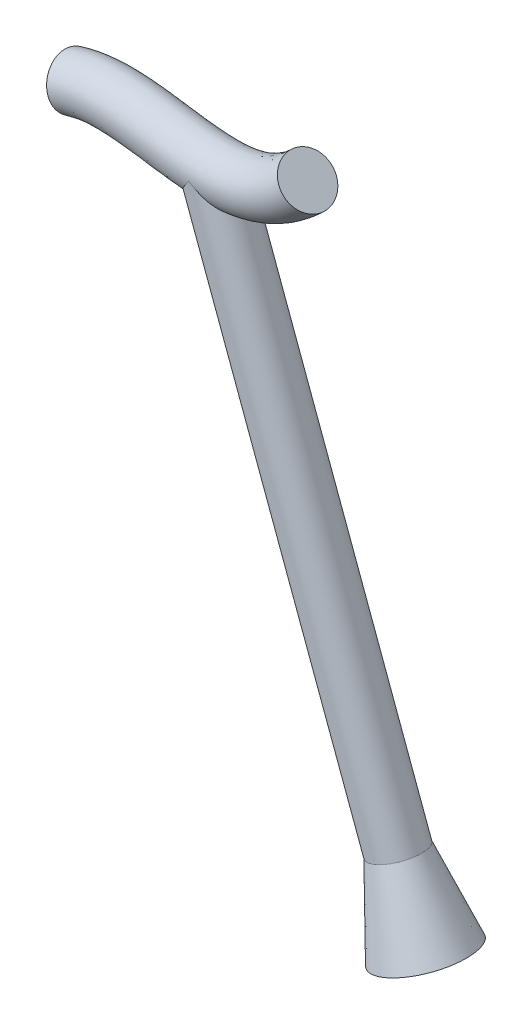
ISO-10303-21;
HEADER;
FILE_DESCRIPTION(('STEP AP214'),'2;1');
FILE_NAME('part.step','',(''),(''),'','','');
FILE_SCHEMA(('AUTOMOTIVE_DESIGN { 1 0 10303 214 1 1 1 1 }'));
ENDSEC;
DATA;
#1=APPLICATION_CONTEXT('core data for automotive mechanical design processes');
#2=APPLICATION_PROTOCOL_DEFINITION('international standard','automotive_design',2000,#1);
#3=PRODUCT_CONTEXT('',#1,'mechanical');
#4=PRODUCT('Part','Part','',(#3));
#5=PRODUCT_RELATED_PRODUCT_CATEGORY('part','',(#4));
#6=PRODUCT_DEFINITION_FORMATION('','',#4);
#7=PRODUCT_DEFINITION_CONTEXT('part definition',#1,'design');
#8=PRODUCT_DEFINITION('design','',#6,#7);
#9=PRODUCT_DEFINITION_SHAPE('','',#8);
#10=(LENGTH_UNIT() NAMED_UNIT(*) SI_UNIT(.MILLI.,.METRE.));
#11=(NAMED_UNIT(*) PLANE_ANGLE_UNIT() SI_UNIT($,.RADIAN.));
#12=(NAMED_UNIT(*) SI_UNIT($,.STERADIAN.) SOLID_ANGLE_UNIT());
#13=UNCERTAINTY_MEASURE_WITH_UNIT(LENGTH_MEASURE(1.E-05),#10,'distance_accuracy_value','');
#14=(GEOMETRIC_REPRESENTATION_CONTEXT(3) GLOBAL_UNCERTAINTY_ASSIGNED_CONTEXT((#13)) GLOBAL_UNIT_ASSIGNED_CONTEXT((#10,
#11,#12)) REPRESENTATION_CONTEXT('',''));
#15=CARTESIAN_POINT('',(0.,0.,0.));
#16=DIRECTION('',(0.,0.,1.));
#17=DIRECTION('',(1.,0.,0.));
#18=AXIS2_PLACEMENT_3D('',#15,#16,#17);
#19=CARTESIAN_POINT('',(-3.8409942819326,11.8952411882299,0.));
#20=CARTESIAN_POINT('',(2.21893063812587,13.8520015925863,0.));
#21=CARTESIAN_POINT('',(8.23706637894599,14.9009551730432,0.));
#22=CARTESIAN_POINT('',(19.9006047173071,15.7834034528897,0.));
#23=CARTESIAN_POINT('',(25.5492961775394,15.6264071761493,0.));
#24=CARTESIAN_POINT('',(36.4282667797137,14.7533963977823,0.));
#25=CARTESIAN_POINT('',(41.6643514853813,14.038061912149,0.));
#26=CARTESIAN_POINT('',(51.7418355635534,12.5815355559079,0.));
#27=CARTESIAN_POINT('',(56.5841652917562,11.8401739007415,0.));
#28=CARTESIAN_POINT('',(65.8524684579819,10.7621530429953,0.));
#29=CARTESIAN_POINT('',(70.2743927939615,10.4263181048556,0.));
#30=CARTESIAN_POINT('',(78.6781011249228,10.4760550908266,0.));
#31=CARTESIAN_POINT('',(82.6521479202523,10.8555686916251,0.));
#32=CARTESIAN_POINT('',(90.3302115567345,12.5779145045922,0.));
#33=CARTESIAN_POINT('',(94.0443000745698,13.9093804203333,0.));
#34=CARTESIAN_POINT('',(101.625127607982,18.016303336636,0.));
#35=CARTESIAN_POINT('',(105.505323844153,20.8047100970525,0.));
#36=CARTESIAN_POINT('',(109.554296204998,24.6991172938591,0.));
#37=CARTESIAN_POINT('',(-3.8409942819326,11.8952411882299,25.));
#38=CARTESIAN_POINT('',(2.21893063812587,13.8520015925863,25.));
#39=CARTESIAN_POINT('',(8.23706637894599,14.9009551730432,25.));
#40=CARTESIAN_POINT('',(19.9006047173071,15.7834034528897,25.));
#41=CARTESIAN_POINT('',(25.5492961775394,15.6264071761493,25.));
#42=CARTESIAN_POINT('',(36.4282667797137,14.7533963977823,25.));
#43=CARTESIAN_POINT('',(41.6643514853813,14.038061912149,25.));
#44=CARTESIAN_POINT('',(51.7418355635534,12.5815355559079,25.));
#45=CARTESIAN_POINT('',(56.5841652917562,11.8401739007415,25.));
#46=CARTESIAN_POINT('',(65.8524684579819,10.7621530429953,25.));
#47=CARTESIAN_POINT('',(70.2743927939615,10.4263181048556,25.));
#48=CARTESIAN_POINT('',(78.6781011249228,10.4760550908266,25.));
#49=CARTESIAN_POINT('',(82.6521479202523,10.8555686916251,25.));
#50=CARTESIAN_POINT('',(90.3302115567345,12.5779145045922,25.));
#51=CARTESIAN_POINT('',(94.0443000745698,13.9093804203333,25.));
#52=CARTESIAN_POINT('',(101.625127607982,18.016303336636,25.));
#53=CARTESIAN_POINT('',(105.505323844153,20.8047100970525,25.));
#54=CARTESIAN_POINT('',(109.554296204998,24.6991172938591,25.));
#55=CARTESIAN_POINT('',(3.8409942819326,-11.8952411882299,25.));
#56=CARTESIAN_POINT('',(7.7970306486509,-10.6178300943379,25.));
#57=CARTESIAN_POINT('',(11.7885963077395,-9.90179155204792,25.));
#58=CARTESIAN_POINT('',(20.1212293950451,-9.27135527129357,25.));
#59=CARTESIAN_POINT('',(24.4590079604851,-9.36646655887717,25.));
#60=CARTESIAN_POINT('',(33.5190344346674,-10.0935115207392,25.));
#61=CARTESIAN_POINT('',(38.2354767797811,-10.7261252151171,25.));
#62=CARTESIAN_POINT('',(48.0183922275681,-12.1400767610303,25.));
#63=CARTESIAN_POINT('',(53.0839349745449,-12.9212448321236,25.));
#64=CARTESIAN_POINT('',(63.5760105825688,-14.1416058995007,25.));
#65=CARTESIAN_POINT('',(69.0065925455896,-14.5816231644159,25.));
#66=CARTESIAN_POINT('',(80.2418190358159,-14.5151279596039,25.));
#67=CARTESIAN_POINT('',(86.0542007625944,-14.0025571707703,25.));
#68=CARTESIAN_POINT('',(97.8722047931959,-11.3515385381499,25.));
#69=CARTESIAN_POINT('',(103.867755420165,-9.20172440187472,25.));
#70=CARTESIAN_POINT('',(115.618705197776,-2.83563247933951,25.));
#71=CARTESIAN_POINT('',(121.360647128679,1.36769554528867,25.));
#72=CARTESIAN_POINT('',(126.884706644812,6.68088003302806,25.));
#73=CARTESIAN_POINT('',(3.8409942819326,-11.8952411882299,0.));
#74=CARTESIAN_POINT('',(7.7970306486509,-10.6178300943379,0.));
#75=CARTESIAN_POINT('',(11.7885963077395,-9.90179155204792,0.));
#76=CARTESIAN_POINT('',(20.1212293950451,-9.27135527129357,0.));
#77=CARTESIAN_POINT('',(24.4590079604808,-9.36646655887934,0.));
#78=CARTESIAN_POINT('',(33.5190344346718,-10.093511520737,0.));
#79=CARTESIAN_POINT('',(38.2354767797811,-10.7261252151214,0.));
#80=CARTESIAN_POINT('',(48.0183922275681,-12.140076761026,0.));
#81=CARTESIAN_POINT('',(53.0839349745449,-12.9212448321193,0.));
#82=CARTESIAN_POINT('',(63.5760105825688,-14.1416058995051,0.));
#83=CARTESIAN_POINT('',(69.0065925455896,-14.581623164418,0.));
#84=CARTESIAN_POINT('',(80.2418190358159,-14.5151279596018,0.));
#85=CARTESIAN_POINT('',(86.0542007625944,-14.0025571707703,0.));
#86=CARTESIAN_POINT('',(97.8722047931959,-11.3515385381499,0.));
#87=CARTESIAN_POINT('',(103.867755420165,-9.2017244018771,0.));
#88=CARTESIAN_POINT('',(115.618705197776,-2.83563247933713,0.));
#89=CARTESIAN_POINT('',(121.360647128679,1.36769554527715,0.));
#90=CARTESIAN_POINT('',(126.884706644812,6.68088003302805,0.));
#91=CARTESIAN_POINT('',(3.8409942819326,-11.8952411882299,-25.));
#92=CARTESIAN_POINT('',(7.7970306486509,-10.6178300943379,-25.));
#93=CARTESIAN_POINT('',(11.7885963077395,-9.90179155204793,-25.));
#94=CARTESIAN_POINT('',(20.1212293950451,-9.27135527129357,-25.));
#95=CARTESIAN_POINT('',(24.4590079604764,-9.36646655888152,-25.));
#96=CARTESIAN_POINT('',(33.5190344346761,-10.0935115207349,-25.));
#97=CARTESIAN_POINT('',(38.2354767797811,-10.7261252151258,-25.));
#98=CARTESIAN_POINT('',(48.0183922275681,-12.1400767610216,-25.));
#99=CARTESIAN_POINT('',(53.0839349745449,-12.921244832115,-25.));
#100=CARTESIAN_POINT('',(63.5760105825688,-14.1416058995094,-25.));
#101=CARTESIAN_POINT('',(69.0065925455896,-14.5816231644201,-25.));
#102=CARTESIAN_POINT('',(80.2418190358159,-14.5151279595997,-25.));
#103=CARTESIAN_POINT('',(86.0542007625944,-14.0025571707703,-25.));
#104=CARTESIAN_POINT('',(97.8722047931959,-11.3515385381499,-25.));
#105=CARTESIAN_POINT('',(103.867755420165,-9.20172440187949,-25.));
#106=CARTESIAN_POINT('',(115.618705197776,-2.83563247933475,-25.));
#107=CARTESIAN_POINT('',(121.360647128679,1.36769554526563,-25.));
#108=CARTESIAN_POINT('',(126.884706644812,6.68088003302805,-25.));
#109=CARTESIAN_POINT('',(-3.8409942819326,11.8952411882299,-25.));
#110=CARTESIAN_POINT('',(2.21893063812587,13.8520015925863,-25.));
#111=CARTESIAN_POINT('',(8.23706637894599,14.9009551730432,-25.));
#112=CARTESIAN_POINT('',(19.9006047173071,15.7834034528897,-25.));
#113=CARTESIAN_POINT('',(25.5492961775394,15.6264071761493,-25.));
#114=CARTESIAN_POINT('',(36.4282667797137,14.7533963977823,-25.));
#115=CARTESIAN_POINT('',(41.6643514853813,14.038061912149,-25.));
#116=CARTESIAN_POINT('',(51.7418355635534,12.5815355559079,-25.));
#117=CARTESIAN_POINT('',(56.5841652917562,11.8401739007415,-25.));
#118=CARTESIAN_POINT('',(65.8524684579819,10.7621530429953,-25.));
#119=CARTESIAN_POINT('',(70.2743927939615,10.4263181048556,-25.));
#120=CARTESIAN_POINT('',(78.6781011249228,10.4760550908266,-25.));
#121=CARTESIAN_POINT('',(82.6521479202523,10.8555686916251,-25.));
#122=CARTESIAN_POINT('',(90.3302115567345,12.5779145045922,-25.));
#123=CARTESIAN_POINT('',(94.0443000745698,13.9093804203333,-25.));
#124=CARTESIAN_POINT('',(101.625127607982,18.016303336636,-25.));
#125=CARTESIAN_POINT('',(105.505323844153,20.8047100970525,-25.));
#126=CARTESIAN_POINT('',(109.554296204998,24.6991172938591,-25.));
#127=CARTESIAN_POINT('',(-3.8409942819326,11.8952411882299,0.));
#128=CARTESIAN_POINT('',(2.21893063812587,13.8520015925863,0.));
#129=CARTESIAN_POINT('',(8.23706637894599,14.9009551730432,0.));
#130=CARTESIAN_POINT('',(19.9006047173071,15.7834034528897,0.));
#131=CARTESIAN_POINT('',(25.5492961775394,15.6264071761493,0.));
#132=CARTESIAN_POINT('',(36.4282667797137,14.7533963977823,0.));
#133=CARTESIAN_POINT('',(41.6643514853813,14.038061912149,0.));
#134=CARTESIAN_POINT('',(51.7418355635534,12.5815355559079,0.));
#135=CARTESIAN_POINT('',(56.5841652917562,11.8401739007415,0.));
#136=CARTESIAN_POINT('',(65.8524684579819,10.7621530429953,0.));
#137=CARTESIAN_POINT('',(70.2743927939615,10.4263181048556,0.));
#138=CARTESIAN_POINT('',(78.6781011249228,10.4760550908266,0.));
#139=CARTESIAN_POINT('',(82.6521479202523,10.8555686916251,0.));
#140=CARTESIAN_POINT('',(90.3302115567345,12.5779145045922,0.));
#141=CARTESIAN_POINT('',(94.0443000745698,13.9093804203333,0.));
#142=CARTESIAN_POINT('',(101.625127607982,18.016303336636,0.));
#143=CARTESIAN_POINT('',(105.505323844153,20.8047100970525,0.));
#144=CARTESIAN_POINT('',(109.554296204998,24.6991172938591,0.));
#145=(BOUNDED_SURFACE() B_SPLINE_SURFACE(3,3,((#19,#20,#21,#22,#23,#24,#25,#26,#27,#28,#29,#30,
#31,#32,#33,#34,#35,#36),(#37,#38,#39,#40,#41,#42,#43,#44,#45,#46,#47,#48,#49,#50,#51,#52,#53,
#54),(#55,#56,#57,#58,#59,#60,#61,#62,#63,#64,#65,#66,#67,#68,#69,#70,#71,#72),(#73,#74,#75,#76,
#77,#78,#79,#80,#81,#82,#83,#84,#85,#86,#87,#88,#89,#90),(#91,#92,#93,#94,#95,#96,#97,#98,#99,
#100,#101,#102,#103,#104,#105,#106,#107,#108),(#109,#110,#111,#112,#113,#114,#115,#116,#117,
#118,#119,#120,#121,#122,#123,#124,#125,#126),(#127,#128,#129,#130,#131,#132,#133,#134,#135,
#136,#137,#138,#139,#140,#141,#142,#143,#144)),.UNSPECIFIED.,.T.,.F.,
.F.) B_SPLINE_SURFACE_WITH_KNOTS((4,3,4),(4,2,2,2,2,2,2,2,4),(0.,0.5,1.),(0.,0.125,0.25,0.375,
0.5,0.625,0.75,0.875,1.),
.UNSPECIFIED.) GEOMETRIC_REPRESENTATION_ITEM() RATIONAL_B_SPLINE_SURFACE(((1.,1.,1.,1.,1.,1.,1.,
1.,1.,1.,1.,1.,1.,1.,1.,1.,1.,1.),(0.333333333333333,0.333333333333333,0.333333333333333,
0.333333333333333,0.333333333333333,0.333333333333333,0.333333333333333,0.333333333333333,
0.333333333333333,0.333333333333333,0.333333333333333,0.333333333333333,0.333333333333333,
0.333333333333333,0.333333333333333,0.333333333333333,0.333333333333333,0.333333333333333),
(0.333333333333333,0.333333333333333,0.333333333333333,0.333333333333333,0.333333333333333,
0.333333333333333,0.333333333333333,0.333333333333333,0.333333333333333,0.333333333333333,
0.333333333333333,0.333333333333333,0.333333333333333,0.333333333333333,0.333333333333333,
0.333333333333333,0.333333333333333,0.333333333333333),(1.,1.,1.,1.,1.,1.,1.,1.,1.,1.,1.,1.,1.,
1.,1.,1.,1.,1.),(0.333333333333333,0.333333333333333,0.333333333333333,0.333333333333333,
0.333333333333333,0.333333333333333,0.333333333333333,0.333333333333333,0.333333333333333,
0.333333333333333,0.333333333333333,0.333333333333333,0.333333333333333,0.333333333333333,
0.333333333333333,0.333333333333333,0.333333333333333,0.333333333333333),(0.333333333333333,
0.333333333333333,0.333333333333333,0.333333333333333,0.333333333333333,0.333333333333333,
0.333333333333333,0.333333333333333,0.333333333333333,0.333333333333333,0.333333333333333,
0.333333333333333,0.333333333333333,0.333333333333333,0.333333333333333,0.333333333333333,
0.333333333333333,0.333333333333333),(1.,1.,1.,1.,1.,1.,1.,1.,1.,1.,1.,1.,1.,1.,1.,1.,1.,1.))) REPRESENTATION_ITEM('') SURFACE());
#146=CARTESIAN_POINT('',(118.219501424905,15.6899986634436,0.));
#147=DIRECTION('',(0.720729490433241,0.693216417592545,0.));
#148=DIRECTION('',(-0.693216417592545,0.720729490433241,0.));
#149=AXIS2_PLACEMENT_3D('',#146,#147,#148);
#150=CIRCLE('',#149,12.5);
#151=CARTESIAN_POINT('',(109.554296204998,24.6991172938591,0.));
#152=VERTEX_POINT('',#151);
#153=EDGE_CURVE('E11',#152,#152,#150,.T.);
#154=CARTESIAN_POINT('',(0.,0.,0.));
#155=DIRECTION('',(0.951619295058392,0.307279542554608,0.));
#156=DIRECTION('',(-0.307279542554608,0.951619295058392,0.));
#157=AXIS2_PLACEMENT_3D('',#154,#155,#156);
#158=CIRCLE('',#157,12.5);
#159=CARTESIAN_POINT('',(-3.8409942819326,11.8952411882299,0.));
#160=VERTEX_POINT('',#159);
#161=EDGE_CURVE('E48',#160,#160,#158,.T.);
#162=CARTESIAN_POINT('',(70.8833939212575,-1.99642209426536,-12.5));
#163=CARTESIAN_POINT('',(70.8788605008631,-2.00270262592796,-12.5000000023641));
#164=CARTESIAN_POINT('',(70.8743268421096,-2.00898306460194,-12.4999950440189));
#165=CARTESIAN_POINT('',(70.5590476205257,-2.44570727571388,-12.4993052403453));
#166=CARTESIAN_POINT('',(70.2472045075634,-2.87568608407201,-12.4753190884259));
#167=CARTESIAN_POINT('',(69.624068319824,-3.73119474749942,-12.3802376486848));
#168=CARTESIAN_POINT('',(69.3127759128584,-4.15672063089727,-12.3091034334096));
#169=CARTESIAN_POINT('',(68.6926493530324,-5.0010358338427,-12.1188698894972));
#170=CARTESIAN_POINT('',(68.3838263943129,-5.41979894145436,-11.9996163087456));
#171=CARTESIAN_POINT('',(67.7728026919778,-6.24530042067836,-11.7126638076479));
#172=CARTESIAN_POINT('',(67.4706003697259,-6.65204166706071,-11.5449765741942));
#173=CARTESIAN_POINT('',(66.8987877807842,-7.41908248918136,-11.1754194300439));
#174=CARTESIAN_POINT('',(66.6284481464538,-7.7805598626948,-10.9771253621857));
#175=CARTESIAN_POINT('',(66.0992661207447,-8.48615146262647,-10.5388036095407));
#176=CARTESIAN_POINT('',(65.8404207737411,-8.83027015576226,-10.2987867322306));
#177=CARTESIAN_POINT('',(65.3382773486164,-9.49615473903047,-9.77808169214339));
#178=CARTESIAN_POINT('',(65.0949316006801,-9.8179894600182,-9.49752786630905));
#179=CARTESIAN_POINT('',(64.6261913333008,-10.4365415133496,-8.89552592477625));
#180=CARTESIAN_POINT('',(64.4008155837477,-10.7332326026691,-8.57403593762222));
#181=CARTESIAN_POINT('',(64.0370185830065,-11.2112274581814,-7.99503904128569));
#182=CARTESIAN_POINT('',(63.8928809374449,-11.4003334537603,-7.74750046590062));
#183=CARTESIAN_POINT('',(63.6168554241514,-11.7620363341834,-7.23423390064919));
#184=CARTESIAN_POINT('',(63.4849646389503,-11.9346371512148,-6.96851026919498));
#185=CARTESIAN_POINT('',(63.2349653202483,-12.2614570933924,-6.42018534728324));
#186=CARTESIAN_POINT('',(63.1168443845787,-12.4156927623066,-6.13759959649122));
#187=CARTESIAN_POINT('',(62.8957252384219,-12.7041582471131,-5.55688771714288));
#188=CARTESIAN_POINT('',(62.7927198643993,-12.8383975401045,-5.2587690412831));
#189=CARTESIAN_POINT('',(62.6024965500513,-13.0861181893895,-4.64657878811815));
#190=CARTESIAN_POINT('',(62.5153906696596,-13.1994522601479,-4.33241255595702));
#191=CARTESIAN_POINT('',(62.3591694055706,-13.4025948338201,-3.69241283754861));
#192=CARTESIAN_POINT('',(62.2900433778863,-13.4924172557191,-3.36658638466832));
#193=CARTESIAN_POINT('',(62.1708231501321,-13.6472678556969,-2.7057275993041));
#194=CARTESIAN_POINT('',(62.1207259292637,-13.7122999692109,-2.37069673707108));
#195=CARTESIAN_POINT('',(62.0403922765108,-13.8165567556893,-1.69425858540681));
#196=CARTESIAN_POINT('',(62.0101564627548,-13.8557806254471,-1.3528510978617));
#197=CARTESIAN_POINT('',(61.9721123144356,-13.9051298541456,-0.701708635828516));
#198=CARTESIAN_POINT('',(61.962338330704,-13.9178055999689,-0.392277916174887));
#199=CARTESIAN_POINT('',(61.95938555996,-13.9216352361026,0.22679116412378));
#200=CARTESIAN_POINT('',(61.9662059562067,-13.9127901856222,0.536429513799831));
#201=CARTESIAN_POINT('',(61.9963396036194,-13.8737038954522,1.15346194401768));
#202=CARTESIAN_POINT('',(62.0196488438955,-13.843467859092,1.46085655197869));
#203=CARTESIAN_POINT('',(62.082424197513,-13.76201130772,2.07118005771075));
#204=CARTESIAN_POINT('',(62.1218904427527,-13.7107906213993,2.3741089190046));
#205=CARTESIAN_POINT('',(62.2148438050151,-13.5900976457469,2.96325110946599));
#206=CARTESIAN_POINT('',(62.267815263501,-13.5212964382466,3.24968408563285));
#207=CARTESIAN_POINT('',(62.3876825972621,-13.3655216733767,3.81456062878617));
#208=CARTESIAN_POINT('',(62.4545779805332,-13.2785487581069,4.09300447767427));
#209=CARTESIAN_POINT('',(62.6015249168939,-13.0873689198479,4.64035576902131));
#210=CARTESIAN_POINT('',(62.6815777629556,-12.9831603031152,4.90926227109302));
#211=CARTESIAN_POINT('',(62.8539697976247,-12.7585713432885,5.43615446008714));
#212=CARTESIAN_POINT('',(62.9463095484638,-12.6381902601625,5.69413964655278));
#213=CARTESIAN_POINT('',(63.1485304802377,-12.3743204601947,6.21391824778825));
#214=CARTESIAN_POINT('',(63.2591502896018,-12.229853735048,6.47492756580338));
#215=CARTESIAN_POINT('',(63.4920853030818,-11.9253132675031,6.98218458326526));
#216=CARTESIAN_POINT('',(63.6144008842635,-11.7652390219231,7.22843180637287));
#217=CARTESIAN_POINT('',(63.869588747214,-11.4308678761968,7.70530852095081));
#218=CARTESIAN_POINT('',(64.0024617112114,-11.2565700568892,7.93593700133575));
#219=CARTESIAN_POINT('',(64.2776795409067,-10.8950656554297,8.38098113692999));
#220=CARTESIAN_POINT('',(64.4200279048983,-10.7078543046993,8.59539074105503));
#221=CARTESIAN_POINT('',(64.7319509728744,-10.2970254368589,9.03398003782317));
#222=CARTESIAN_POINT('',(64.902671358299,-10.0718240256886,9.25586315019352));
#223=CARTESIAN_POINT('',(65.2533243914284,-9.60843515433736,9.67787735234512));
#224=CARTESIAN_POINT('',(65.4332605025484,-9.37024280974402,9.87800017470829));
#225=CARTESIAN_POINT('',(65.8009851993093,-8.8825140667575,10.2562323583331));
#226=CARTESIAN_POINT('',(65.9887766965238,-8.63297345912575,10.4343334588064));
#227=CARTESIAN_POINT('',(66.3708778502338,-8.12416946537924,10.7683571648492));
#228=CARTESIAN_POINT('',(66.5651897631191,-7.8649027097931,10.9242719929776));
#229=CARTESIAN_POINT('',(67.2181250983613,-6.99174918196306,11.404259983087));
#230=CARTESIAN_POINT('',(67.6885680653803,-6.35952421384584,11.6801034308268));
#231=CARTESIAN_POINT('',(68.6441405285086,-5.06760405339333,12.1134446427612));
#232=CARTESIAN_POINT('',(69.1292590045247,-4.40792934030471,12.2710290222687));
#233=CARTESIAN_POINT('',(69.8248827863353,-3.45568959312487,12.4134496656025));
#234=CARTESIAN_POINT('',(70.03406695883,-3.1685261320925,12.4455472481836));
#235=CARTESIAN_POINT('',(70.4522572960651,-2.59273963894484,12.4885776210311));
#236=CARTESIAN_POINT('',(70.6612634565821,-2.30411810197096,12.4995288860879));
#237=CARTESIAN_POINT('',(70.8743268338628,-2.00898307571868,12.499995043863));
#238=CARTESIAN_POINT('',(70.8788604926876,-2.00270263691041,12.5000000022411));
#239=CARTESIAN_POINT('',(70.8833939212572,-1.99642209426462,12.5));
#240=B_SPLINE_CURVE_WITH_KNOTS('',3,(#162,#163,#164,#165,#166,#167,#168,#169,#170,#171,#172,
#173,#174,#175,#176,#177,#178,#179,#180,#181,#182,#183,#184,#185,#186,#187,#188,#189,#190,#191,
#192,#193,#194,#195,#196,#197,#198,#199,#200,#201,#202,#203,#204,#205,#206,#207,#208,#209,#210,
#211,#212,#213,#214,#215,#216,#217,#218,#219,#220,#221,#222,#223,#224,#225,#226,#227,#228,#229,
#230,#231,#232,#233,#234,#235,#236,#237,#238,#239),.UNSPECIFIED.,.F.,.F.,(4,2,2,2,2,2,2,2,2,2,2,
2,2,2,2,2,2,2,2,2,2,2,2,2,2,2,2,2,2,2,2,2,2,2,2,2,2,2,4),(0.,0.0232375044377404,
1.61589680243782,3.20987270869315,4.80899940301187,6.40774055484781,7.88472569669971,
9.36132882302326,10.8331462733749,12.3064814471818,13.3352085054178,14.3636898663228,
15.3912376225851,16.4182968218646,17.4523365827908,18.485762796648,19.5190248868014,
20.5523191327063,21.4806859935812,22.4090071630893,23.3371025972983,24.265205608199,
25.1621242781854,26.0590112607859,26.9559864324294,27.8530026625377,28.80653316351,
29.7600944161945,30.7137173391478,31.6676943112687,32.7445022208157,33.8217178244789,
34.899336295187,35.9773316014123,38.4717585066307,40.964356655685,42.0340673056477,
43.1028429636082,43.1260804680462),.UNSPECIFIED.);
#241=CARTESIAN_POINT('',(70.8833939212572,-1.99642209426462,12.5));
#242=VERTEX_POINT('',#241);
#243=CARTESIAN_POINT('',(70.8833939212575,-1.99642209426536,-12.5));
#244=VERTEX_POINT('',#243);
#245=EDGE_CURVE('E56',#242,#244,#240,.F.);
#246=CARTESIAN_POINT('',(70.8833939212575,-1.99642209426536,-12.5));
#247=CARTESIAN_POINT('',(70.8896742869409,-2.00095582797467,-12.4999999983891));
#248=CARTESIAN_POINT('',(70.8959548801108,-2.00548926930621,-12.499997757362));
#249=CARTESIAN_POINT('',(71.3092672993291,-2.30379529442233,-12.4997028453625));
#250=CARTESIAN_POINT('',(71.7172492845662,-2.59633546649777,-12.4900026856099));
#251=CARTESIAN_POINT('',(72.534519361312,-3.17836757783163,-12.4511663885178));
#252=CARTESIAN_POINT('',(72.9438076170995,-3.4678591122809,-12.4220277023065));
#253=CARTESIAN_POINT('',(73.7641088763109,-4.04396941713133,-12.3434070574586));
#254=CARTESIAN_POINT('',(74.1751235762192,-4.33057854304256,-12.293871399682));
#255=CARTESIAN_POINT('',(74.997037674837,-4.89953336809004,-12.1734459610974));
#256=CARTESIAN_POINT('',(75.4079370626725,-5.18187874793855,-12.1025545893268));
#257=CARTESIAN_POINT('',(76.2481733382089,-5.75490568958278,-11.9342936876984));
#258=CARTESIAN_POINT('',(76.6774573653698,-6.04534478758677,-11.8358249108733));
#259=CARTESIAN_POINT('',(77.5335678839909,-6.61991916070666,-11.6124325689005));
#260=CARTESIAN_POINT('',(77.960393695065,-6.90405274733612,-11.4875020100542));
#261=CARTESIAN_POINT('',(78.8099919601886,-7.46503535806251,-11.2091616445813));
#262=CARTESIAN_POINT('',(79.2327617348833,-7.74187975284092,-11.0557342152375));
#263=CARTESIAN_POINT('',(80.0699799521608,-8.28565964312778,-10.7188858503238));
#264=CARTESIAN_POINT('',(80.484455781843,-8.55263170599996,-10.5355929078248));
#265=CARTESIAN_POINT('',(81.3037894102784,-9.07614001285452,-10.1361215268271));
#266=CARTESIAN_POINT('',(81.7086519911445,-9.33268149277923,-9.91995985266153));
#267=CARTESIAN_POINT('',(82.5047951118438,-9.83318733239106,-9.452086014982));
#268=CARTESIAN_POINT('',(82.8960915244559,-10.0771665644579,-9.20041727355646));
#269=CARTESIAN_POINT('',(83.5259494636541,-10.4669228065231,-8.75381450220637));
#270=CARTESIAN_POINT('',(83.7697982681065,-10.6170416637977,-8.57008497415246));
#271=CARTESIAN_POINT('',(84.2481660605265,-10.9101282732571,-8.18555650350859));
#272=CARTESIAN_POINT('',(84.4826863104123,-11.053096993353,-7.98475988127291));
#273=CARTESIAN_POINT('',(84.9405705671792,-11.3309576185788,-7.56516081840703));
#274=CARTESIAN_POINT('',(85.1639260655319,-11.4658433788845,-7.34634497185619));
#275=CARTESIAN_POINT('',(85.5968937854152,-11.7261890566955,-6.89018754618767));
#276=CARTESIAN_POINT('',(85.8065055110408,-11.8516486341076,-6.65284529927366));
#277=CARTESIAN_POINT('',(86.2118745935003,-12.093309730504,-6.15588979680427));
#278=CARTESIAN_POINT('',(86.4074058980779,-12.2093628715718,-5.89601847520701));
#279=CARTESIAN_POINT('',(86.7780291690475,-12.4285411627168,-5.35684599473646));
#280=CARTESIAN_POINT('',(86.9531193600545,-12.5316651899108,-5.0775431515221));
#281=CARTESIAN_POINT('',(87.2786862360125,-12.7228163537051,-4.50074322298228));
#282=CARTESIAN_POINT('',(87.4292170342255,-12.8108767024125,-4.20328817795175));
#283=CARTESIAN_POINT('',(87.6337577726359,-12.930228057848,-3.7445292783042));
#284=CARTESIAN_POINT('',(87.6983886180218,-12.9678846946928,-3.5895339683824));
#285=CARTESIAN_POINT('',(87.8201264685993,-13.0387304188814,-3.27555100506406));
#286=CARTESIAN_POINT('',(87.8772312617463,-13.0719181928064,-3.11656219417953));
#287=CARTESIAN_POINT('',(88.008089978949,-13.1478926424584,-2.72023797027518));
#288=CARTESIAN_POINT('',(88.0772448309869,-13.1879706109883,-2.48083622549292));
#289=CARTESIAN_POINT('',(88.1968971198213,-13.2572410118903,-1.99593579870479));
#290=CARTESIAN_POINT('',(88.2473995641624,-13.2864363658982,-1.75043877199337));
#291=CARTESIAN_POINT('',(88.3286520594604,-13.3333781655289,-1.2552432709718));
#292=CARTESIAN_POINT('',(88.3594137070106,-13.351131332811,-1.00554735191143));
#293=CARTESIAN_POINT('',(88.4005145551269,-13.3748463299045,-0.503903044719156));
#294=CARTESIAN_POINT('',(88.4108525232616,-13.3808074481452,-0.251954521579244));
#295=CARTESIAN_POINT('',(88.4108511671826,-13.3808067232671,0.261178463865919));
#296=CARTESIAN_POINT('',(88.3997410009907,-13.3744003964241,0.522363373410993));
#297=CARTESIAN_POINT('',(88.3555854605151,-13.3489220094083,1.0422419924368));
#298=CARTESIAN_POINT('',(88.3225393382446,-13.3298495173361,1.30093561666285));
#299=CARTESIAN_POINT('',(88.2353095924219,-13.2794481731732,1.81366981225089));
#300=CARTESIAN_POINT('',(88.1811123949972,-13.248111450377,2.06770728565979));
#301=CARTESIAN_POINT('',(88.0528460122081,-13.1738334775015,2.56895044065112));
#302=CARTESIAN_POINT('',(87.9787764024701,-13.1308919796031,2.81615597621381));
#303=CARTESIAN_POINT('',(87.8130031763245,-13.0346006655426,3.30016501461181));
#304=CARTESIAN_POINT('',(87.7214455543895,-12.9813369714649,3.53703597486351));
#305=CARTESIAN_POINT('',(87.522015594119,-12.8650578053512,4.00127931712574));
#306=CARTESIAN_POINT('',(87.4141436753494,-12.8020425841009,4.22865194321949));
#307=CARTESIAN_POINT('',(87.1838143007954,-12.6671487675205,4.67310905537375));
#308=CARTESIAN_POINT('',(87.0613570600463,-12.595270302863,4.89019369304694));
#309=CARTESIAN_POINT('',(86.8034824851375,-12.4434805410455,5.31370890027355));
#310=CARTESIAN_POINT('',(86.66805808228,-12.3635648614067,5.52013356336907));
#311=CARTESIAN_POINT('',(86.3199442492535,-12.1575113836841,6.01590434588867));
#312=CARTESIAN_POINT('',(86.1007088668,-12.027217881924,6.29895083039134));
#313=CARTESIAN_POINT('',(85.6422741946376,-11.7534100483066,6.84154986296844));
#314=CARTESIAN_POINT('',(85.4030648987079,-11.6098890861806,7.10109049807902));
#315=CARTESIAN_POINT('',(84.9080284972444,-11.311303488491,7.59775986779404));
#316=CARTESIAN_POINT('',(84.6521686070722,-11.1562159853164,7.8348419823421));
#317=CARTESIAN_POINT('',(84.1274658830354,-10.8364061151449,8.28695448534527));
#318=CARTESIAN_POINT('',(83.8586232720998,-10.671683913577,8.50198525225076));
#319=CARTESIAN_POINT('',(83.1604292695893,-10.2414329635322,9.02322993529766));
#320=CARTESIAN_POINT('',(82.7237808590249,-9.97008574381867,9.3149159679445));
#321=CARTESIAN_POINT('',(81.8329450787299,-9.41134218550491,9.85267231320418));
#322=CARTESIAN_POINT('',(81.3787472579314,-9.12393623667213,10.0987149220231));
#323=CARTESIAN_POINT('',(80.4581688912793,-8.53592851191678,10.5492256297721));
#324=CARTESIAN_POINT('',(79.9917819680726,-8.2353197699511,10.7536714531213));
#325=CARTESIAN_POINT('',(79.0512803685401,-7.62341024334438,11.124353584644));
#326=CARTESIAN_POINT('',(78.5771680364039,-7.31211267149453,11.290601260632));
#327=CARTESIAN_POINT('',(77.5107553654949,-6.6053894239487,11.6234704216379));
#328=CARTESIAN_POINT('',(76.9171503367853,-6.20755559412378,11.7807870826852));
#329=CARTESIAN_POINT('',(75.7274836819541,-5.40125372229974,12.0465114549906));
#330=CARTESIAN_POINT('',(75.1314258506105,-4.99279899055184,12.1549775312628));
#331=CARTESIAN_POINT('',(73.9284117351511,-4.15953279256532,12.3286655468797));
#332=CARTESIAN_POINT('',(73.3214522048304,-3.73455927540752,12.3930748283202));
#333=CARTESIAN_POINT('',(72.1096944843148,-2.87728722131787,12.4785219967825));
#334=CARTESIAN_POINT('',(71.5048961211618,-2.44498928721159,12.4995634358172));
#335=CARTESIAN_POINT('',(70.8959548741825,-2.00548926567223,12.4999977555106));
#336=CARTESIAN_POINT('',(70.8896742810015,-2.00095582433916,12.4999999965104));
#337=CARTESIAN_POINT('',(70.8833939212572,-1.99642209426462,12.5));
#338=B_SPLINE_CURVE_WITH_KNOTS('',3,(#246,#247,#248,#249,#250,#251,#252,#253,#254,#255,#256,
#257,#258,#259,#260,#261,#262,#263,#264,#265,#266,#267,#268,#269,#270,#271,#272,#273,#274,#275,
#276,#277,#278,#279,#280,#281,#282,#283,#284,#285,#286,#287,#288,#289,#290,#291,#292,#293,#294,
#295,#296,#297,#298,#299,#300,#301,#302,#303,#304,#305,#306,#307,#308,#309,#310,#311,#312,#313,
#314,#315,#316,#317,#318,#319,#320,#321,#322,#323,#324,#325,#326,#327,#328,#329,#330,#331,#332,
#333,#334,#335,#336,#337),.UNSPECIFIED.,.F.,.F.,(4,2,2,2,2,2,2,2,2,2,2,2,2,2,2,2,2,2,2,2,2,2,2,
2,2,2,2,2,2,2,2,2,2,2,2,2,2,2,2,2,2,2,2,2,2,4),(0.,0.0232375006651249,1.52915517937384,
3.03527035997564,4.54537630524781,6.05559477855075,7.63766210645891,9.22014808866701,
10.8036159724062,12.3804680250019,13.9565185027528,15.5306580486292,16.5508003863065,
17.5708042518482,18.5915739559594,19.6123804713937,20.6470105703167,21.6817304638778,
22.7141387705399,23.2302125228805,23.7464376220756,24.5026143959507,25.2585880139523,
26.0141171330244,26.769691841794,27.5529278025358,28.3361904719545,29.1199566352825,
29.9037395371929,30.6812445976851,31.4587296659517,32.2362032729621,33.0141031380283,
34.1553176822823,35.2971074045,36.4412176047033,37.5853081661338,39.3557394695935,
41.127241865464,42.8996904397445,44.6716108459989,46.8647273250602,49.0552165466647,
51.2850937086414,53.5147882268204,53.5380257274856),.UNSPECIFIED.);
#339=EDGE_CURVE('E54',#244,#242,#338,.T.);
#340=ORIENTED_EDGE('',*,*,#153,.F.);
#341=EDGE_LOOP('',(#340));
#342=FACE_BOUND('',#341,.T.);
#343=ORIENTED_EDGE('',*,*,#161,.T.);
#344=EDGE_LOOP('',(#343));
#345=FACE_BOUND('',#344,.T.);
#346=ORIENTED_EDGE('',*,*,#245,.F.);
#347=ORIENTED_EDGE('',*,*,#339,.F.);
#348=EDGE_LOOP('',(#346,#347));
#349=FACE_BOUND('',#348,.T.);
#350=ADVANCED_FACE('F39',(#342,#345,#349),#145,.T.);
#351=CARTESIAN_POINT('',(0.,0.,0.));
#352=DIRECTION('',(0.951619295058392,0.307279542554608,0.));
#353=DIRECTION('',(-0.307279542554608,0.951619295058392,0.));
#354=AXIS2_PLACEMENT_3D('',#351,#352,#353);
#355=PLANE('',#354);
#356=ORIENTED_EDGE('',*,*,#161,.F.);
#357=EDGE_LOOP('',(#356));
#358=FACE_BOUND('',#357,.T.);
#359=ADVANCED_FACE('F41',(#358),#355,.F.);
#360=CARTESIAN_POINT('',(118.219501424905,15.6899986634436,0.));
#361=DIRECTION('',(0.720729490433241,0.693216417592545,0.));
#362=DIRECTION('',(-0.693216417592545,0.720729490433241,0.));
#363=AXIS2_PLACEMENT_3D('',#360,#361,#362);
#364=PLANE('',#363);
#365=ORIENTED_EDGE('',*,*,#153,.T.);
#366=EDGE_LOOP('',(#365));
#367=FACE_BOUND('',#366,.T.);
#368=ADVANCED_FACE('F94',(#367),#364,.T.);
#369=CARTESIAN_POINT('',(57.4066488873398,34.5085244596958,0.));
#370=DIRECTION('',(0.346328751222055,-0.93811321069313,0.));
#371=DIRECTION('',(0.93811321069313,0.346328751222055,0.));
#372=AXIS2_PLACEMENT_3D('',#369,#370,#371);
#373=CYLINDRICAL_SURFACE('',#372,12.5);
#374=ORIENTED_EDGE('',*,*,#245,.T.);
#375=ORIENTED_EDGE('',*,*,#339,.T.);
#376=EDGE_LOOP('',(#374,#375));
#377=FACE_BOUND('',#376,.T.);
#378=CARTESIAN_POINT('',(163.655125907879,-253.290566887145,0.));
#379=DIRECTION('',(0.346328751222056,-0.938113210693129,0.));
#380=DIRECTION('',(0.938113210693129,0.346328751222056,0.));
#381=AXIS2_PLACEMENT_3D('',#378,#379,#380);
#382=CIRCLE('',#381,12.5);
#383=CARTESIAN_POINT('',(175.381541041543,-248.961457496869,0.));
#384=VERTEX_POINT('',#383);
#385=EDGE_CURVE('E61',#384,#384,#382,.T.);
#386=ORIENTED_EDGE('',*,*,#385,.F.);
#387=EDGE_LOOP('',(#386));
#388=FACE_BOUND('',#387,.T.);
#389=ADVANCED_FACE('F57',(#377,#388),#373,.T.);
#390=CARTESIAN_POINT('',(177.508275956761,-290.81509531487,0.));
#391=DIRECTION('',(0.346328751222056,-0.938113210693129,0.));
#392=DIRECTION('',(0.938113210693129,0.346328751222056,0.));
#393=AXIS2_PLACEMENT_3D('',#390,#391,#392);
#394=CONICAL_SURFACE('',#393,22.,0.233179800646816);
#395=ORIENTED_EDGE('',*,*,#385,.T.);
#396=EDGE_LOOP('',(#395));
#397=FACE_BOUND('',#396,.T.);
#398=CARTESIAN_POINT('',(177.508275956761,-290.81509531487,0.));
#399=DIRECTION('',(0.346328751222056,-0.938113210693129,0.));
#400=DIRECTION('',(0.938113210693129,0.346328751222056,0.));
#401=AXIS2_PLACEMENT_3D('',#398,#399,#400);
#402=CIRCLE('',#401,22.);
#403=CARTESIAN_POINT('',(198.14676659201,-283.195862787985,0.));
#404=VERTEX_POINT('',#403);
#405=EDGE_CURVE('E149',#404,#404,#402,.T.);
#406=ORIENTED_EDGE('',*,*,#405,.F.);
#407=EDGE_LOOP('',(#406));
#408=FACE_BOUND('',#407,.T.);
#409=ADVANCED_FACE('F106',(#397,#408),#394,.T.);
#410=CARTESIAN_POINT('',(198.14676659201,-283.195862787985,0.));
#411=DIRECTION('',(0.346328751222056,-0.938113210693129,0.));
#412=DIRECTION('',(0.938113210693129,0.346328751222056,0.));
#413=AXIS2_PLACEMENT_3D('',#410,#411,#412);
#414=PLANE('',#413);
#415=ORIENTED_EDGE('',*,*,#405,.T.);
#416=EDGE_LOOP('',(#415));
#417=FACE_BOUND('',#416,.T.);
#418=ADVANCED_FACE('F134',(#417),#414,.T.);
#419=CLOSED_SHELL('',(#350,#359,#368,#389,#409,#418));
#420=MANIFOLD_SOLID_BREP('B2',#419);
#421=ADVANCED_BREP_SHAPE_REPRESENTATION('',(#18,#420),#14);
#422=SHAPE_DEFINITION_REPRESENTATION(#9,#421);
ENDSEC;
END-ISO-10303-21;
